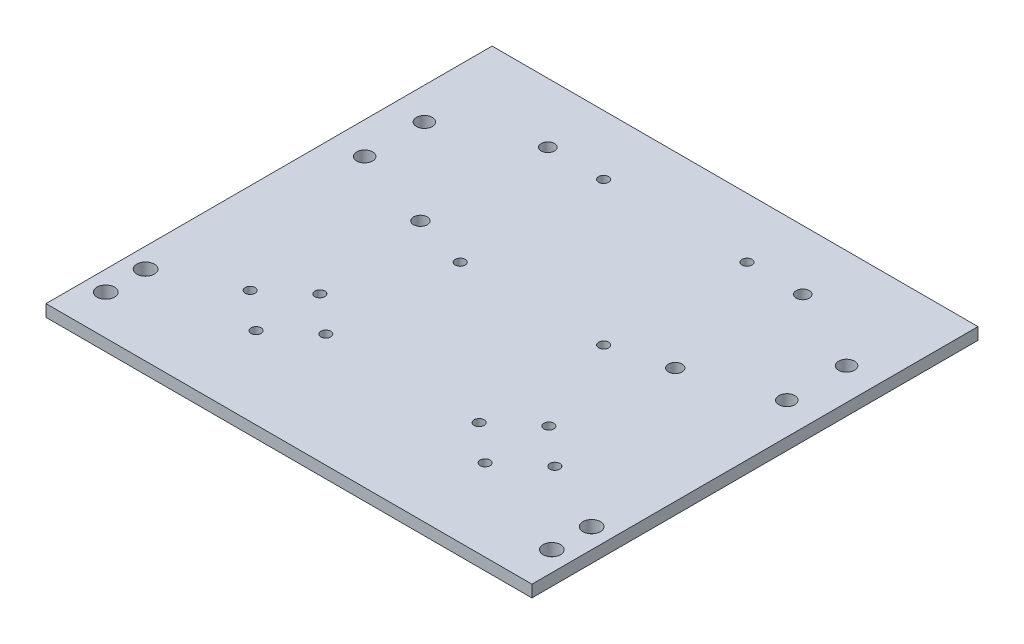
ISO-10303-21;
HEADER;
FILE_DESCRIPTION(('STEP AP214'),'2;1');
FILE_NAME('part.step','',(''),(''),'','','');
FILE_SCHEMA(('AUTOMOTIVE_DESIGN { 1 0 10303 214 1 1 1 1 }'));
ENDSEC;
DATA;
#1=APPLICATION_CONTEXT('core data for automotive mechanical design processes');
#2=APPLICATION_PROTOCOL_DEFINITION('international standard','automotive_design',2000,#1);
#3=PRODUCT_CONTEXT('',#1,'mechanical');
#4=PRODUCT('Part','Part','',(#3));
#5=PRODUCT_RELATED_PRODUCT_CATEGORY('part','',(#4));
#6=PRODUCT_DEFINITION_FORMATION('','',#4);
#7=PRODUCT_DEFINITION_CONTEXT('part definition',#1,'design');
#8=PRODUCT_DEFINITION('design','',#6,#7);
#9=PRODUCT_DEFINITION_SHAPE('','',#8);
#10=(LENGTH_UNIT() NAMED_UNIT(*) SI_UNIT(.MILLI.,.METRE.));
#11=(NAMED_UNIT(*) PLANE_ANGLE_UNIT() SI_UNIT($,.RADIAN.));
#12=(NAMED_UNIT(*) SI_UNIT($,.STERADIAN.) SOLID_ANGLE_UNIT());
#13=UNCERTAINTY_MEASURE_WITH_UNIT(LENGTH_MEASURE(1.E-05),#10,'distance_accuracy_value','');
#14=(GEOMETRIC_REPRESENTATION_CONTEXT(3) GLOBAL_UNCERTAINTY_ASSIGNED_CONTEXT((#13)) GLOBAL_UNIT_ASSIGNED_CONTEXT((#10,
#11,#12)) REPRESENTATION_CONTEXT('',''));
#15=CARTESIAN_POINT('',(0.,0.,0.));
#16=DIRECTION('',(0.,0.,1.));
#17=DIRECTION('',(1.,0.,0.));
#18=AXIS2_PLACEMENT_3D('',#15,#16,#17);
#19=CARTESIAN_POINT('',(61.,3.,-56.));
#20=DIRECTION('',(-1.,0.,0.));
#21=DIRECTION('',(0.,0.,1.));
#22=AXIS2_PLACEMENT_3D('',#19,#20,#21);
#23=PLANE('',#22);
#24=DIRECTION('',(0.,0.,-1.));
#25=VECTOR('',#24,1.);
#26=CARTESIAN_POINT('',(61.,0.,-56.));
#27=LINE('',#26,#25);
#28=CARTESIAN_POINT('',(61.,0.,56.));
#29=VERTEX_POINT('',#28);
#30=CARTESIAN_POINT('',(61.,0.,-56.));
#31=VERTEX_POINT('',#30);
#32=EDGE_CURVE('E111',#29,#31,#27,.T.);
#33=ORIENTED_EDGE('',*,*,#32,.T.);
#34=DIRECTION('',(0.,-1.,0.));
#35=VECTOR('',#34,1.);
#36=CARTESIAN_POINT('',(61.,3.,-56.));
#37=LINE('',#36,#35);
#38=CARTESIAN_POINT('',(61.,3.,-56.));
#39=VERTEX_POINT('',#38);
#40=EDGE_CURVE('E11',#39,#31,#37,.T.);
#41=ORIENTED_EDGE('',*,*,#40,.F.);
#42=DIRECTION('',(0.,0.,-1.));
#43=VECTOR('',#42,1.);
#44=CARTESIAN_POINT('',(61.,3.,-56.));
#45=LINE('',#44,#43);
#46=CARTESIAN_POINT('',(61.,3.,56.));
#47=VERTEX_POINT('',#46);
#48=EDGE_CURVE('E98',#47,#39,#45,.T.);
#49=ORIENTED_EDGE('',*,*,#48,.F.);
#50=DIRECTION('',(0.,-1.,0.));
#51=VECTOR('',#50,1.);
#52=CARTESIAN_POINT('',(61.,3.,56.));
#53=LINE('',#52,#51);
#54=EDGE_CURVE('E107',#47,#29,#53,.T.);
#55=ORIENTED_EDGE('',*,*,#54,.T.);
#56=EDGE_LOOP('',(#33,#41,#49,#55));
#57=FACE_BOUND('',#56,.T.);
#58=ADVANCED_FACE('F45',(#57),#23,.F.);
#59=CARTESIAN_POINT('',(-61.,3.,-56.));
#60=DIRECTION('',(0.,0.,1.));
#61=DIRECTION('',(1.,0.,0.));
#62=AXIS2_PLACEMENT_3D('',#59,#60,#61);
#63=PLANE('',#62);
#64=DIRECTION('',(-1.,0.,0.));
#65=VECTOR('',#64,1.);
#66=CARTESIAN_POINT('',(-61.,0.,-56.));
#67=LINE('',#66,#65);
#68=CARTESIAN_POINT('',(-61.,0.,-56.));
#69=VERTEX_POINT('',#68);
#70=EDGE_CURVE('E102',#31,#69,#67,.T.);
#71=ORIENTED_EDGE('',*,*,#70,.T.);
#72=DIRECTION('',(0.,-1.,0.));
#73=VECTOR('',#72,1.);
#74=CARTESIAN_POINT('',(-61.,3.,-56.));
#75=LINE('',#74,#73);
#76=CARTESIAN_POINT('',(-61.,3.,-56.));
#77=VERTEX_POINT('',#76);
#78=EDGE_CURVE('E54',#77,#69,#75,.T.);
#79=ORIENTED_EDGE('',*,*,#78,.F.);
#80=DIRECTION('',(-1.,0.,0.));
#81=VECTOR('',#80,1.);
#82=CARTESIAN_POINT('',(-61.,3.,-56.));
#83=LINE('',#82,#81);
#84=EDGE_CURVE('E93',#39,#77,#83,.T.);
#85=ORIENTED_EDGE('',*,*,#84,.F.);
#86=ORIENTED_EDGE('',*,*,#40,.T.);
#87=EDGE_LOOP('',(#71,#79,#85,#86));
#88=FACE_BOUND('',#87,.T.);
#89=ADVANCED_FACE('F101',(#88),#63,.F.);
#90=CARTESIAN_POINT('',(-61.,3.,-56.));
#91=DIRECTION('',(1.,0.,0.));
#92=DIRECTION('',(0.,0.,-1.));
#93=AXIS2_PLACEMENT_3D('',#90,#91,#92);
#94=PLANE('',#93);
#95=DIRECTION('',(0.,0.,1.));
#96=VECTOR('',#95,1.);
#97=CARTESIAN_POINT('',(-61.,0.,-56.));
#98=LINE('',#97,#96);
#99=CARTESIAN_POINT('',(-61.,0.,56.));
#100=VERTEX_POINT('',#99);
#101=EDGE_CURVE('E80',#69,#100,#98,.T.);
#102=ORIENTED_EDGE('',*,*,#101,.T.);
#103=DIRECTION('',(0.,-1.,0.));
#104=VECTOR('',#103,1.);
#105=CARTESIAN_POINT('',(-61.,3.,56.));
#106=LINE('',#105,#104);
#107=CARTESIAN_POINT('',(-61.,3.,56.));
#108=VERTEX_POINT('',#107);
#109=EDGE_CURVE('E103',#108,#100,#106,.T.);
#110=ORIENTED_EDGE('',*,*,#109,.F.);
#111=DIRECTION('',(0.,0.,1.));
#112=VECTOR('',#111,1.);
#113=CARTESIAN_POINT('',(-61.,3.,-56.));
#114=LINE('',#113,#112);
#115=EDGE_CURVE('E96',#77,#108,#114,.T.);
#116=ORIENTED_EDGE('',*,*,#115,.F.);
#117=ORIENTED_EDGE('',*,*,#78,.T.);
#118=EDGE_LOOP('',(#102,#110,#116,#117));
#119=FACE_BOUND('',#118,.T.);
#120=ADVANCED_FACE('F105',(#119),#94,.F.);
#121=CARTESIAN_POINT('',(-61.,3.,56.));
#122=DIRECTION('',(0.,0.,-1.));
#123=DIRECTION('',(-1.,0.,0.));
#124=AXIS2_PLACEMENT_3D('',#121,#122,#123);
#125=PLANE('',#124);
#126=DIRECTION('',(1.,0.,0.));
#127=VECTOR('',#126,1.);
#128=CARTESIAN_POINT('',(-61.,0.,56.));
#129=LINE('',#128,#127);
#130=EDGE_CURVE('E86',#100,#29,#129,.T.);
#131=ORIENTED_EDGE('',*,*,#130,.T.);
#132=ORIENTED_EDGE('',*,*,#54,.F.);
#133=DIRECTION('',(1.,0.,0.));
#134=VECTOR('',#133,1.);
#135=CARTESIAN_POINT('',(-61.,3.,56.));
#136=LINE('',#135,#134);
#137=EDGE_CURVE('E63',#108,#47,#136,.T.);
#138=ORIENTED_EDGE('',*,*,#137,.F.);
#139=ORIENTED_EDGE('',*,*,#109,.T.);
#140=EDGE_LOOP('',(#131,#132,#138,#139));
#141=FACE_BOUND('',#140,.T.);
#142=ADVANCED_FACE('F270',(#141),#125,.F.);
#143=CARTESIAN_POINT('',(0.,3.,0.));
#144=DIRECTION('',(0.,1.,0.));
#145=DIRECTION('',(0.,0.,1.));
#146=AXIS2_PLACEMENT_3D('',#143,#144,#145);
#147=PLANE('',#146);
#148=CARTESIAN_POINT('',(56.,3.,46.));
#149=DIRECTION('',(0.,-1.,0.));
#150=DIRECTION('',(0.,0.,1.));
#151=AXIS2_PLACEMENT_3D('',#148,#149,#150);
#152=CIRCLE('',#151,2.2);
#153=CARTESIAN_POINT('',(56.,3.,48.2));
#154=VERTEX_POINT('',#153);
#155=EDGE_CURVE('E195',#154,#154,#152,.T.);
#156=ORIENTED_EDGE('',*,*,#155,.T.);
#157=EDGE_LOOP('',(#156));
#158=FACE_BOUND('',#157,.T.);
#159=CARTESIAN_POINT('',(56.,3.,36.));
#160=DIRECTION('',(0.,-1.,0.));
#161=DIRECTION('',(0.,0.,1.));
#162=AXIS2_PLACEMENT_3D('',#159,#160,#161);
#163=CIRCLE('',#162,2.2);
#164=CARTESIAN_POINT('',(56.,3.,38.2));
#165=VERTEX_POINT('',#164);
#166=EDGE_CURVE('E201',#165,#165,#163,.T.);
#167=ORIENTED_EDGE('',*,*,#166,.T.);
#168=EDGE_LOOP('',(#167));
#169=FACE_BOUND('',#168,.T.);
#170=CARTESIAN_POINT('',(-56.,3.,46.));
#171=DIRECTION('',(0.,1.,0.));
#172=DIRECTION('',(0.,0.,1.));
#173=AXIS2_PLACEMENT_3D('',#170,#171,#172);
#174=CIRCLE('',#173,2.2);
#175=CARTESIAN_POINT('',(-56.,3.,48.2));
#176=VERTEX_POINT('',#175);
#177=EDGE_CURVE('E190',#176,#176,#174,.T.);
#178=ORIENTED_EDGE('',*,*,#177,.F.);
#179=EDGE_LOOP('',(#178));
#180=FACE_BOUND('',#179,.T.);
#181=CARTESIAN_POINT('',(-56.,3.,36.));
#182=DIRECTION('',(0.,1.,0.));
#183=DIRECTION('',(0.,0.,1.));
#184=AXIS2_PLACEMENT_3D('',#181,#182,#183);
#185=CIRCLE('',#184,2.2);
#186=CARTESIAN_POINT('',(-56.,3.,38.2));
#187=VERTEX_POINT('',#186);
#188=EDGE_CURVE('E199',#187,#187,#185,.T.);
#189=ORIENTED_EDGE('',*,*,#188,.F.);
#190=EDGE_LOOP('',(#189));
#191=FACE_BOUND('',#190,.T.);
#192=CARTESIAN_POINT('',(32.,3.,-41.));
#193=DIRECTION('',(0.,1.,0.));
#194=DIRECTION('',(0.,0.,-1.));
#195=AXIS2_PLACEMENT_3D('',#192,#193,#194);
#196=CIRCLE('',#195,1.65);
#197=CARTESIAN_POINT('',(32.,3.,-42.65));
#198=VERTEX_POINT('',#197);
#199=EDGE_CURVE('E192',#198,#198,#196,.T.);
#200=ORIENTED_EDGE('',*,*,#199,.F.);
#201=EDGE_LOOP('',(#200));
#202=FACE_BOUND('',#201,.T.);
#203=CARTESIAN_POINT('',(32.,3.,-9.00000000000002));
#204=DIRECTION('',(0.,1.,0.));
#205=DIRECTION('',(0.,0.,-1.));
#206=AXIS2_PLACEMENT_3D('',#203,#204,#205);
#207=CIRCLE('',#206,1.72273902263788);
#208=CARTESIAN_POINT('',(32.,3.,-10.7227390226379));
#209=VERTEX_POINT('',#208);
#210=EDGE_CURVE('E215',#209,#209,#207,.T.);
#211=ORIENTED_EDGE('',*,*,#210,.F.);
#212=EDGE_LOOP('',(#211));
#213=FACE_BOUND('',#212,.T.);
#214=CARTESIAN_POINT('',(-32.,3.,-9.00000000000002));
#215=DIRECTION('',(0.,1.,0.));
#216=DIRECTION('',(0.,0.,1.));
#217=AXIS2_PLACEMENT_3D('',#214,#215,#216);
#218=CIRCLE('',#217,1.72273902263788);
#219=CARTESIAN_POINT('',(-32.,3.,-7.27726097736215));
#220=VERTEX_POINT('',#219);
#221=EDGE_CURVE('E212',#220,#220,#218,.T.);
#222=ORIENTED_EDGE('',*,*,#221,.F.);
#223=EDGE_LOOP('',(#222));
#224=FACE_BOUND('',#223,.T.);
#225=CARTESIAN_POINT('',(-32.,3.,-41.));
#226=DIRECTION('',(0.,1.,0.));
#227=DIRECTION('',(0.,0.,1.));
#228=AXIS2_PLACEMENT_3D('',#225,#226,#227);
#229=CIRCLE('',#228,1.65);
#230=CARTESIAN_POINT('',(-32.,3.,-39.35));
#231=VERTEX_POINT('',#230);
#232=EDGE_CURVE('E176',#231,#231,#229,.T.);
#233=ORIENTED_EDGE('',*,*,#232,.F.);
#234=EDGE_LOOP('',(#233));
#235=FACE_BOUND('',#234,.T.);
#236=CARTESIAN_POINT('',(-38.25,3.,27.5));
#237=DIRECTION('',(0.,1.,0.));
#238=DIRECTION('',(0.,0.,1.));
#239=AXIS2_PLACEMENT_3D('',#236,#237,#238);
#240=CIRCLE('',#239,1.25);
#241=CARTESIAN_POINT('',(-38.25,3.,28.75));
#242=VERTEX_POINT('',#241);
#243=EDGE_CURVE('E150',#242,#242,#240,.T.);
#244=ORIENTED_EDGE('',*,*,#243,.F.);
#245=EDGE_LOOP('',(#244));
#246=FACE_BOUND('',#245,.T.);
#247=CARTESIAN_POINT('',(28.75,3.,19.5));
#248=DIRECTION('',(0.,1.,0.));
#249=DIRECTION('',(0.,0.,-1.));
#250=AXIS2_PLACEMENT_3D('',#247,#248,#249);
#251=CIRCLE('',#250,1.25);
#252=CARTESIAN_POINT('',(28.75,3.,18.25));
#253=VERTEX_POINT('',#252);
#254=EDGE_CURVE('E185',#253,#253,#251,.T.);
#255=ORIENTED_EDGE('',*,*,#254,.F.);
#256=EDGE_LOOP('',(#255));
#257=FACE_BOUND('',#256,.T.);
#258=CARTESIAN_POINT('',(28.75,3.,35.5));
#259=DIRECTION('',(0.,1.,0.));
#260=DIRECTION('',(0.,0.,1.));
#261=AXIS2_PLACEMENT_3D('',#258,#259,#260);
#262=CIRCLE('',#261,1.25);
#263=CARTESIAN_POINT('',(28.75,3.,36.75));
#264=VERTEX_POINT('',#263);
#265=EDGE_CURVE('E229',#264,#264,#262,.T.);
#266=ORIENTED_EDGE('',*,*,#265,.F.);
#267=EDGE_LOOP('',(#266));
#268=FACE_BOUND('',#267,.T.);
#269=CARTESIAN_POINT('',(19.25,3.,27.5));
#270=DIRECTION('',(0.,1.,0.));
#271=DIRECTION('',(0.,0.,1.));
#272=AXIS2_PLACEMENT_3D('',#269,#270,#271);
#273=CIRCLE('',#272,1.25);
#274=CARTESIAN_POINT('',(19.25,3.,28.75));
#275=VERTEX_POINT('',#274);
#276=EDGE_CURVE('E225',#275,#275,#273,.T.);
#277=ORIENTED_EDGE('',*,*,#276,.F.);
#278=EDGE_LOOP('',(#277));
#279=FACE_BOUND('',#278,.T.);
#280=CARTESIAN_POINT('',(38.25,3.,27.5));
#281=DIRECTION('',(0.,1.,0.));
#282=DIRECTION('',(0.,0.,-1.));
#283=AXIS2_PLACEMENT_3D('',#280,#281,#282);
#284=CIRCLE('',#283,1.25);
#285=CARTESIAN_POINT('',(38.25,3.,26.25));
#286=VERTEX_POINT('',#285);
#287=EDGE_CURVE('E228',#286,#286,#284,.T.);
#288=ORIENTED_EDGE('',*,*,#287,.F.);
#289=EDGE_LOOP('',(#288));
#290=FACE_BOUND('',#289,.T.);
#291=CARTESIAN_POINT('',(-19.25,3.,27.5));
#292=DIRECTION('',(0.,1.,0.));
#293=DIRECTION('',(0.,0.,-1.));
#294=AXIS2_PLACEMENT_3D('',#291,#292,#293);
#295=CIRCLE('',#294,1.25);
#296=CARTESIAN_POINT('',(-19.25,3.,26.25));
#297=VERTEX_POINT('',#296);
#298=EDGE_CURVE('E239',#297,#297,#295,.T.);
#299=ORIENTED_EDGE('',*,*,#298,.F.);
#300=EDGE_LOOP('',(#299));
#301=FACE_BOUND('',#300,.T.);
#302=CARTESIAN_POINT('',(-28.75,3.,19.5));
#303=DIRECTION('',(0.,1.,0.));
#304=DIRECTION('',(0.,0.,1.));
#305=AXIS2_PLACEMENT_3D('',#302,#303,#304);
#306=CIRCLE('',#305,1.25);
#307=CARTESIAN_POINT('',(-28.75,3.,20.75));
#308=VERTEX_POINT('',#307);
#309=EDGE_CURVE('E236',#308,#308,#306,.T.);
#310=ORIENTED_EDGE('',*,*,#309,.F.);
#311=EDGE_LOOP('',(#310));
#312=FACE_BOUND('',#311,.T.);
#313=CARTESIAN_POINT('',(-28.75,3.,35.5));
#314=DIRECTION('',(0.,1.,0.));
#315=DIRECTION('',(0.,0.,-1.));
#316=AXIS2_PLACEMENT_3D('',#313,#314,#315);
#317=CIRCLE('',#316,1.25);
#318=CARTESIAN_POINT('',(-28.75,3.,34.25));
#319=VERTEX_POINT('',#318);
#320=EDGE_CURVE('E224',#319,#319,#317,.T.);
#321=ORIENTED_EDGE('',*,*,#320,.F.);
#322=EDGE_LOOP('',(#321));
#323=FACE_BOUND('',#322,.T.);
#324=CARTESIAN_POINT('',(18.,3.,-41.));
#325=DIRECTION('',(0.,1.,0.));
#326=DIRECTION('',(0.,0.,-1.));
#327=AXIS2_PLACEMENT_3D('',#324,#325,#326);
#328=CIRCLE('',#327,1.25);
#329=CARTESIAN_POINT('',(18.,3.,-42.25));
#330=VERTEX_POINT('',#329);
#331=EDGE_CURVE('E171',#330,#330,#328,.T.);
#332=ORIENTED_EDGE('',*,*,#331,.F.);
#333=EDGE_LOOP('',(#332));
#334=FACE_BOUND('',#333,.T.);
#335=CARTESIAN_POINT('',(18.,3.,-5.00000000000002));
#336=DIRECTION('',(0.,1.,0.));
#337=DIRECTION('',(0.,0.,-1.));
#338=AXIS2_PLACEMENT_3D('',#335,#336,#337);
#339=CIRCLE('',#338,1.25);
#340=CARTESIAN_POINT('',(18.,3.,-6.25000000000003));
#341=VERTEX_POINT('',#340);
#342=EDGE_CURVE('E247',#341,#341,#339,.T.);
#343=ORIENTED_EDGE('',*,*,#342,.F.);
#344=EDGE_LOOP('',(#343));
#345=FACE_BOUND('',#344,.T.);
#346=CARTESIAN_POINT('',(-18.,3.,-5.00000000000002));
#347=DIRECTION('',(0.,1.,0.));
#348=DIRECTION('',(0.,0.,1.));
#349=AXIS2_PLACEMENT_3D('',#346,#347,#348);
#350=CIRCLE('',#349,1.25);
#351=CARTESIAN_POINT('',(-18.,3.,-3.75000000000002));
#352=VERTEX_POINT('',#351);
#353=EDGE_CURVE('E244',#352,#352,#350,.T.);
#354=ORIENTED_EDGE('',*,*,#353,.F.);
#355=EDGE_LOOP('',(#354));
#356=FACE_BOUND('',#355,.T.);
#357=CARTESIAN_POINT('',(-18.,3.,-41.));
#358=DIRECTION('',(0.,1.,0.));
#359=DIRECTION('',(0.,0.,1.));
#360=AXIS2_PLACEMENT_3D('',#357,#358,#359);
#361=CIRCLE('',#360,1.25);
#362=CARTESIAN_POINT('',(-18.,3.,-39.75));
#363=VERTEX_POINT('',#362);
#364=EDGE_CURVE('E136',#363,#363,#361,.T.);
#365=ORIENTED_EDGE('',*,*,#364,.F.);
#366=EDGE_LOOP('',(#365));
#367=FACE_BOUND('',#366,.T.);
#368=CARTESIAN_POINT('',(53.,3.,-31.));
#369=DIRECTION('',(0.,1.,0.));
#370=DIRECTION('',(0.,0.,-1.));
#371=AXIS2_PLACEMENT_3D('',#368,#369,#370);
#372=CIRCLE('',#371,2.);
#373=CARTESIAN_POINT('',(53.,3.,-33.));
#374=VERTEX_POINT('',#373);
#375=EDGE_CURVE('E145',#374,#374,#372,.T.);
#376=ORIENTED_EDGE('',*,*,#375,.F.);
#377=EDGE_LOOP('',(#376));
#378=FACE_BOUND('',#377,.T.);
#379=CARTESIAN_POINT('',(53.,3.,-16.));
#380=DIRECTION('',(0.,1.,0.));
#381=DIRECTION('',(0.,0.,-1.));
#382=AXIS2_PLACEMENT_3D('',#379,#380,#381);
#383=CIRCLE('',#382,2.);
#384=CARTESIAN_POINT('',(53.,3.,-18.));
#385=VERTEX_POINT('',#384);
#386=EDGE_CURVE('E257',#385,#385,#383,.T.);
#387=ORIENTED_EDGE('',*,*,#386,.F.);
#388=EDGE_LOOP('',(#387));
#389=FACE_BOUND('',#388,.T.);
#390=CARTESIAN_POINT('',(-53.,3.,-16.));
#391=DIRECTION('',(0.,1.,0.));
#392=DIRECTION('',(0.,0.,1.));
#393=AXIS2_PLACEMENT_3D('',#390,#391,#392);
#394=CIRCLE('',#393,2.);
#395=CARTESIAN_POINT('',(-53.,3.,-14.));
#396=VERTEX_POINT('',#395);
#397=EDGE_CURVE('E254',#396,#396,#394,.T.);
#398=ORIENTED_EDGE('',*,*,#397,.F.);
#399=EDGE_LOOP('',(#398));
#400=FACE_BOUND('',#399,.T.);
#401=CARTESIAN_POINT('',(-53.,3.,-31.));
#402=DIRECTION('',(0.,1.,0.));
#403=DIRECTION('',(0.,0.,1.));
#404=AXIS2_PLACEMENT_3D('',#401,#402,#403);
#405=CIRCLE('',#404,2.);
#406=CARTESIAN_POINT('',(-53.,3.,-29.));
#407=VERTEX_POINT('',#406);
#408=EDGE_CURVE('E124',#407,#407,#405,.T.);
#409=ORIENTED_EDGE('',*,*,#408,.F.);
#410=EDGE_LOOP('',(#409));
#411=FACE_BOUND('',#410,.T.);
#412=ORIENTED_EDGE('',*,*,#48,.T.);
#413=ORIENTED_EDGE('',*,*,#84,.T.);
#414=ORIENTED_EDGE('',*,*,#115,.T.);
#415=ORIENTED_EDGE('',*,*,#137,.T.);
#416=EDGE_LOOP('',(#412,#413,#414,#415));
#417=FACE_BOUND('',#416,.T.);
#418=ADVANCED_FACE('F94',(#158,#169,#180,#191,#202,#213,#224,#235,#246,#257,#268,#279,#290,#301,
#312,#323,#334,#345,#356,#367,#378,#389,#400,#411,#417),#147,.T.);
#419=CARTESIAN_POINT('',(0.,0.,0.));
#420=DIRECTION('',(0.,1.,0.));
#421=DIRECTION('',(0.,0.,1.));
#422=AXIS2_PLACEMENT_3D('',#419,#420,#421);
#423=PLANE('',#422);
#424=CARTESIAN_POINT('',(56.,0.,46.));
#425=DIRECTION('',(0.,1.,0.));
#426=DIRECTION('',(0.,0.,1.));
#427=AXIS2_PLACEMENT_3D('',#424,#425,#426);
#428=CIRCLE('',#427,2.2);
#429=CARTESIAN_POINT('',(56.,0.,48.2));
#430=VERTEX_POINT('',#429);
#431=EDGE_CURVE('E48',#430,#430,#428,.F.);
#432=ORIENTED_EDGE('',*,*,#431,.F.);
#433=EDGE_LOOP('',(#432));
#434=FACE_BOUND('',#433,.T.);
#435=CARTESIAN_POINT('',(56.,0.,36.));
#436=DIRECTION('',(0.,1.,0.));
#437=DIRECTION('',(0.,0.,1.));
#438=AXIS2_PLACEMENT_3D('',#435,#436,#437);
#439=CIRCLE('',#438,2.2);
#440=CARTESIAN_POINT('',(56.,0.,38.2));
#441=VERTEX_POINT('',#440);
#442=EDGE_CURVE('E193',#441,#441,#439,.F.);
#443=ORIENTED_EDGE('',*,*,#442,.F.);
#444=EDGE_LOOP('',(#443));
#445=FACE_BOUND('',#444,.T.);
#446=CARTESIAN_POINT('',(-56.,0.,46.));
#447=DIRECTION('',(0.,1.,0.));
#448=DIRECTION('',(0.,0.,1.));
#449=AXIS2_PLACEMENT_3D('',#446,#447,#448);
#450=CIRCLE('',#449,2.2);
#451=CARTESIAN_POINT('',(-56.,0.,48.2));
#452=VERTEX_POINT('',#451);
#453=EDGE_CURVE('E189',#452,#452,#450,.T.);
#454=ORIENTED_EDGE('',*,*,#453,.T.);
#455=EDGE_LOOP('',(#454));
#456=FACE_BOUND('',#455,.T.);
#457=CARTESIAN_POINT('',(-56.,0.,36.));
#458=DIRECTION('',(0.,1.,0.));
#459=DIRECTION('',(0.,0.,1.));
#460=AXIS2_PLACEMENT_3D('',#457,#458,#459);
#461=CIRCLE('',#460,2.2);
#462=CARTESIAN_POINT('',(-56.,0.,38.2));
#463=VERTEX_POINT('',#462);
#464=EDGE_CURVE('E186',#463,#463,#461,.T.);
#465=ORIENTED_EDGE('',*,*,#464,.T.);
#466=EDGE_LOOP('',(#465));
#467=FACE_BOUND('',#466,.T.);
#468=CARTESIAN_POINT('',(32.,0.,-41.));
#469=DIRECTION('',(0.,1.,0.));
#470=DIRECTION('',(0.,0.,1.));
#471=AXIS2_PLACEMENT_3D('',#468,#469,#470);
#472=CIRCLE('',#471,1.65);
#473=CARTESIAN_POINT('',(32.,0.,-39.35));
#474=VERTEX_POINT('',#473);
#475=EDGE_CURVE('E182',#474,#474,#472,.T.);
#476=ORIENTED_EDGE('',*,*,#475,.T.);
#477=EDGE_LOOP('',(#476));
#478=FACE_BOUND('',#477,.T.);
#479=CARTESIAN_POINT('',(32.,0.,-9.00000000000002));
#480=DIRECTION('',(0.,1.,0.));
#481=DIRECTION('',(0.,0.,1.));
#482=AXIS2_PLACEMENT_3D('',#479,#480,#481);
#483=CIRCLE('',#482,1.72273902263788);
#484=CARTESIAN_POINT('',(32.,0.,-7.27726097736215));
#485=VERTEX_POINT('',#484);
#486=EDGE_CURVE('E179',#485,#485,#483,.T.);
#487=ORIENTED_EDGE('',*,*,#486,.T.);
#488=EDGE_LOOP('',(#487));
#489=FACE_BOUND('',#488,.T.);
#490=CARTESIAN_POINT('',(-32.,0.,-9.00000000000002));
#491=DIRECTION('',(0.,1.,0.));
#492=DIRECTION('',(0.,0.,1.));
#493=AXIS2_PLACEMENT_3D('',#490,#491,#492);
#494=CIRCLE('',#493,1.72273902263788);
#495=CARTESIAN_POINT('',(-32.,0.,-7.27726097736215));
#496=VERTEX_POINT('',#495);
#497=EDGE_CURVE('E175',#496,#496,#494,.T.);
#498=ORIENTED_EDGE('',*,*,#497,.T.);
#499=EDGE_LOOP('',(#498));
#500=FACE_BOUND('',#499,.T.);
#501=CARTESIAN_POINT('',(-32.,0.,-41.));
#502=DIRECTION('',(0.,1.,0.));
#503=DIRECTION('',(0.,0.,1.));
#504=AXIS2_PLACEMENT_3D('',#501,#502,#503);
#505=CIRCLE('',#504,1.65);
#506=CARTESIAN_POINT('',(-32.,0.,-39.35));
#507=VERTEX_POINT('',#506);
#508=EDGE_CURVE('E172',#507,#507,#505,.T.);
#509=ORIENTED_EDGE('',*,*,#508,.T.);
#510=EDGE_LOOP('',(#509));
#511=FACE_BOUND('',#510,.T.);
#512=CARTESIAN_POINT('',(-38.25,0.,27.5));
#513=DIRECTION('',(0.,1.,0.));
#514=DIRECTION('',(0.,0.,1.));
#515=AXIS2_PLACEMENT_3D('',#512,#513,#514);
#516=CIRCLE('',#515,1.25);
#517=CARTESIAN_POINT('',(-38.25,0.,28.75));
#518=VERTEX_POINT('',#517);
#519=EDGE_CURVE('E168',#518,#518,#516,.T.);
#520=ORIENTED_EDGE('',*,*,#519,.T.);
#521=EDGE_LOOP('',(#520));
#522=FACE_BOUND('',#521,.T.);
#523=CARTESIAN_POINT('',(28.75,0.,19.5));
#524=DIRECTION('',(0.,1.,0.));
#525=DIRECTION('',(0.,0.,1.));
#526=AXIS2_PLACEMENT_3D('',#523,#524,#525);
#527=CIRCLE('',#526,1.25);
#528=CARTESIAN_POINT('',(28.75,0.,20.75));
#529=VERTEX_POINT('',#528);
#530=EDGE_CURVE('E165',#529,#529,#527,.T.);
#531=ORIENTED_EDGE('',*,*,#530,.T.);
#532=EDGE_LOOP('',(#531));
#533=FACE_BOUND('',#532,.T.);
#534=CARTESIAN_POINT('',(28.75,0.,35.5));
#535=DIRECTION('',(0.,1.,0.));
#536=DIRECTION('',(0.,0.,1.));
#537=AXIS2_PLACEMENT_3D('',#534,#535,#536);
#538=CIRCLE('',#537,1.25);
#539=CARTESIAN_POINT('',(28.75,0.,36.75));
#540=VERTEX_POINT('',#539);
#541=EDGE_CURVE('E162',#540,#540,#538,.T.);
#542=ORIENTED_EDGE('',*,*,#541,.T.);
#543=EDGE_LOOP('',(#542));
#544=FACE_BOUND('',#543,.T.);
#545=CARTESIAN_POINT('',(19.25,0.,27.5));
#546=DIRECTION('',(0.,1.,0.));
#547=DIRECTION('',(0.,0.,1.));
#548=AXIS2_PLACEMENT_3D('',#545,#546,#547);
#549=CIRCLE('',#548,1.25);
#550=CARTESIAN_POINT('',(19.25,0.,28.75));
#551=VERTEX_POINT('',#550);
#552=EDGE_CURVE('E159',#551,#551,#549,.T.);
#553=ORIENTED_EDGE('',*,*,#552,.T.);
#554=EDGE_LOOP('',(#553));
#555=FACE_BOUND('',#554,.T.);
#556=CARTESIAN_POINT('',(38.25,0.,27.5));
#557=DIRECTION('',(0.,1.,0.));
#558=DIRECTION('',(0.,0.,1.));
#559=AXIS2_PLACEMENT_3D('',#556,#557,#558);
#560=CIRCLE('',#559,1.25);
#561=CARTESIAN_POINT('',(38.25,0.,28.75));
#562=VERTEX_POINT('',#561);
#563=EDGE_CURVE('E156',#562,#562,#560,.T.);
#564=ORIENTED_EDGE('',*,*,#563,.T.);
#565=EDGE_LOOP('',(#564));
#566=FACE_BOUND('',#565,.T.);
#567=CARTESIAN_POINT('',(-19.25,0.,27.5));
#568=DIRECTION('',(0.,1.,0.));
#569=DIRECTION('',(0.,0.,1.));
#570=AXIS2_PLACEMENT_3D('',#567,#568,#569);
#571=CIRCLE('',#570,1.25);
#572=CARTESIAN_POINT('',(-19.25,0.,28.75));
#573=VERTEX_POINT('',#572);
#574=EDGE_CURVE('E153',#573,#573,#571,.T.);
#575=ORIENTED_EDGE('',*,*,#574,.T.);
#576=EDGE_LOOP('',(#575));
#577=FACE_BOUND('',#576,.T.);
#578=CARTESIAN_POINT('',(-28.75,0.,19.5));
#579=DIRECTION('',(0.,1.,0.));
#580=DIRECTION('',(0.,0.,1.));
#581=AXIS2_PLACEMENT_3D('',#578,#579,#580);
#582=CIRCLE('',#581,1.25);
#583=CARTESIAN_POINT('',(-28.75,0.,20.75));
#584=VERTEX_POINT('',#583);
#585=EDGE_CURVE('E149',#584,#584,#582,.T.);
#586=ORIENTED_EDGE('',*,*,#585,.T.);
#587=EDGE_LOOP('',(#586));
#588=FACE_BOUND('',#587,.T.);
#589=CARTESIAN_POINT('',(-28.75,0.,35.5));
#590=DIRECTION('',(0.,1.,0.));
#591=DIRECTION('',(0.,0.,1.));
#592=AXIS2_PLACEMENT_3D('',#589,#590,#591);
#593=CIRCLE('',#592,1.25);
#594=CARTESIAN_POINT('',(-28.75,0.,36.75));
#595=VERTEX_POINT('',#594);
#596=EDGE_CURVE('E146',#595,#595,#593,.T.);
#597=ORIENTED_EDGE('',*,*,#596,.T.);
#598=EDGE_LOOP('',(#597));
#599=FACE_BOUND('',#598,.T.);
#600=CARTESIAN_POINT('',(18.,0.,-41.));
#601=DIRECTION('',(0.,1.,0.));
#602=DIRECTION('',(0.,0.,1.));
#603=AXIS2_PLACEMENT_3D('',#600,#601,#602);
#604=CIRCLE('',#603,1.25);
#605=CARTESIAN_POINT('',(18.,0.,-39.75));
#606=VERTEX_POINT('',#605);
#607=EDGE_CURVE('E142',#606,#606,#604,.T.);
#608=ORIENTED_EDGE('',*,*,#607,.T.);
#609=EDGE_LOOP('',(#608));
#610=FACE_BOUND('',#609,.T.);
#611=CARTESIAN_POINT('',(18.,0.,-5.00000000000002));
#612=DIRECTION('',(0.,1.,0.));
#613=DIRECTION('',(0.,0.,1.));
#614=AXIS2_PLACEMENT_3D('',#611,#612,#613);
#615=CIRCLE('',#614,1.25);
#616=CARTESIAN_POINT('',(18.,0.,-3.75000000000002));
#617=VERTEX_POINT('',#616);
#618=EDGE_CURVE('E139',#617,#617,#615,.T.);
#619=ORIENTED_EDGE('',*,*,#618,.T.);
#620=EDGE_LOOP('',(#619));
#621=FACE_BOUND('',#620,.T.);
#622=CARTESIAN_POINT('',(-18.,0.,-5.00000000000002));
#623=DIRECTION('',(0.,1.,0.));
#624=DIRECTION('',(0.,0.,1.));
#625=AXIS2_PLACEMENT_3D('',#622,#623,#624);
#626=CIRCLE('',#625,1.25);
#627=CARTESIAN_POINT('',(-18.,0.,-3.75000000000002));
#628=VERTEX_POINT('',#627);
#629=EDGE_CURVE('E135',#628,#628,#626,.T.);
#630=ORIENTED_EDGE('',*,*,#629,.T.);
#631=EDGE_LOOP('',(#630));
#632=FACE_BOUND('',#631,.T.);
#633=CARTESIAN_POINT('',(-18.,0.,-41.));
#634=DIRECTION('',(0.,1.,0.));
#635=DIRECTION('',(0.,0.,1.));
#636=AXIS2_PLACEMENT_3D('',#633,#634,#635);
#637=CIRCLE('',#636,1.25);
#638=CARTESIAN_POINT('',(-18.,0.,-39.75));
#639=VERTEX_POINT('',#638);
#640=EDGE_CURVE('E132',#639,#639,#637,.T.);
#641=ORIENTED_EDGE('',*,*,#640,.T.);
#642=EDGE_LOOP('',(#641));
#643=FACE_BOUND('',#642,.T.);
#644=CARTESIAN_POINT('',(53.,0.,-31.));
#645=DIRECTION('',(0.,1.,0.));
#646=DIRECTION('',(0.,0.,1.));
#647=AXIS2_PLACEMENT_3D('',#644,#645,#646);
#648=CIRCLE('',#647,2.);
#649=CARTESIAN_POINT('',(53.,0.,-29.));
#650=VERTEX_POINT('',#649);
#651=EDGE_CURVE('E114',#650,#650,#648,.T.);
#652=ORIENTED_EDGE('',*,*,#651,.T.);
#653=EDGE_LOOP('',(#652));
#654=FACE_BOUND('',#653,.T.);
#655=CARTESIAN_POINT('',(53.,0.,-16.));
#656=DIRECTION('',(0.,1.,0.));
#657=DIRECTION('',(0.,0.,1.));
#658=AXIS2_PLACEMENT_3D('',#655,#656,#657);
#659=CIRCLE('',#658,2.);
#660=CARTESIAN_POINT('',(53.,0.,-14.));
#661=VERTEX_POINT('',#660);
#662=EDGE_CURVE('E127',#661,#661,#659,.T.);
#663=ORIENTED_EDGE('',*,*,#662,.T.);
#664=EDGE_LOOP('',(#663));
#665=FACE_BOUND('',#664,.T.);
#666=CARTESIAN_POINT('',(-53.,0.,-16.));
#667=DIRECTION('',(0.,1.,0.));
#668=DIRECTION('',(0.,0.,1.));
#669=AXIS2_PLACEMENT_3D('',#666,#667,#668);
#670=CIRCLE('',#669,2.);
#671=CARTESIAN_POINT('',(-53.,0.,-14.));
#672=VERTEX_POINT('',#671);
#673=EDGE_CURVE('E123',#672,#672,#670,.T.);
#674=ORIENTED_EDGE('',*,*,#673,.T.);
#675=EDGE_LOOP('',(#674));
#676=FACE_BOUND('',#675,.T.);
#677=CARTESIAN_POINT('',(-53.,0.,-31.));
#678=DIRECTION('',(0.,1.,0.));
#679=DIRECTION('',(0.,0.,1.));
#680=AXIS2_PLACEMENT_3D('',#677,#678,#679);
#681=CIRCLE('',#680,2.);
#682=CARTESIAN_POINT('',(-53.,0.,-29.));
#683=VERTEX_POINT('',#682);
#684=EDGE_CURVE('E120',#683,#683,#681,.T.);
#685=ORIENTED_EDGE('',*,*,#684,.T.);
#686=EDGE_LOOP('',(#685));
#687=FACE_BOUND('',#686,.T.);
#688=ORIENTED_EDGE('',*,*,#32,.F.);
#689=ORIENTED_EDGE('',*,*,#130,.F.);
#690=ORIENTED_EDGE('',*,*,#101,.F.);
#691=ORIENTED_EDGE('',*,*,#70,.F.);
#692=EDGE_LOOP('',(#688,#689,#690,#691));
#693=FACE_BOUND('',#692,.T.);
#694=ADVANCED_FACE('F269',(#434,#445,#456,#467,#478,#489,#500,#511,#522,#533,#544,#555,#566,
#577,#588,#599,#610,#621,#632,#643,#654,#665,#676,#687,#693),#423,.F.);
#695=CARTESIAN_POINT('',(-53.,-7.,-31.));
#696=DIRECTION('',(0.,1.,0.));
#697=DIRECTION('',(0.,0.,1.));
#698=AXIS2_PLACEMENT_3D('',#695,#696,#697);
#699=CYLINDRICAL_SURFACE('',#698,2.);
#700=ORIENTED_EDGE('',*,*,#408,.T.);
#701=EDGE_LOOP('',(#700));
#702=FACE_BOUND('',#701,.T.);
#703=ORIENTED_EDGE('',*,*,#684,.F.);
#704=EDGE_LOOP('',(#703));
#705=FACE_BOUND('',#704,.T.);
#706=ADVANCED_FACE('F265',(#702,#705),#699,.F.);
#707=CARTESIAN_POINT('',(-53.,-7.,-16.));
#708=DIRECTION('',(0.,1.,0.));
#709=DIRECTION('',(0.,0.,1.));
#710=AXIS2_PLACEMENT_3D('',#707,#708,#709);
#711=CYLINDRICAL_SURFACE('',#710,2.);
#712=ORIENTED_EDGE('',*,*,#397,.T.);
#713=EDGE_LOOP('',(#712));
#714=FACE_BOUND('',#713,.T.);
#715=ORIENTED_EDGE('',*,*,#673,.F.);
#716=EDGE_LOOP('',(#715));
#717=FACE_BOUND('',#716,.T.);
#718=ADVANCED_FACE('F305',(#714,#717),#711,.F.);
#719=CARTESIAN_POINT('',(53.,-7.,-16.));
#720=DIRECTION('',(0.,1.,0.));
#721=DIRECTION('',(0.,0.,1.));
#722=AXIS2_PLACEMENT_3D('',#719,#720,#721);
#723=CYLINDRICAL_SURFACE('',#722,2.);
#724=ORIENTED_EDGE('',*,*,#386,.T.);
#725=EDGE_LOOP('',(#724));
#726=FACE_BOUND('',#725,.T.);
#727=ORIENTED_EDGE('',*,*,#662,.F.);
#728=EDGE_LOOP('',(#727));
#729=FACE_BOUND('',#728,.T.);
#730=ADVANCED_FACE('F312',(#726,#729),#723,.F.);
#731=CARTESIAN_POINT('',(53.,-7.,-31.));
#732=DIRECTION('',(0.,1.,0.));
#733=DIRECTION('',(0.,0.,1.));
#734=AXIS2_PLACEMENT_3D('',#731,#732,#733);
#735=CYLINDRICAL_SURFACE('',#734,2.);
#736=ORIENTED_EDGE('',*,*,#375,.T.);
#737=EDGE_LOOP('',(#736));
#738=FACE_BOUND('',#737,.T.);
#739=ORIENTED_EDGE('',*,*,#651,.F.);
#740=EDGE_LOOP('',(#739));
#741=FACE_BOUND('',#740,.T.);
#742=ADVANCED_FACE('F320',(#738,#741),#735,.F.);
#743=CARTESIAN_POINT('',(-18.,-20.,-41.));
#744=DIRECTION('',(0.,1.,0.));
#745=DIRECTION('',(0.,0.,1.));
#746=AXIS2_PLACEMENT_3D('',#743,#744,#745);
#747=CYLINDRICAL_SURFACE('',#746,1.25);
#748=ORIENTED_EDGE('',*,*,#364,.T.);
#749=EDGE_LOOP('',(#748));
#750=FACE_BOUND('',#749,.T.);
#751=ORIENTED_EDGE('',*,*,#640,.F.);
#752=EDGE_LOOP('',(#751));
#753=FACE_BOUND('',#752,.T.);
#754=ADVANCED_FACE('F328',(#750,#753),#747,.F.);
#755=CARTESIAN_POINT('',(-18.,-20.,-5.00000000000002));
#756=DIRECTION('',(0.,1.,0.));
#757=DIRECTION('',(0.,0.,1.));
#758=AXIS2_PLACEMENT_3D('',#755,#756,#757);
#759=CYLINDRICAL_SURFACE('',#758,1.25);
#760=ORIENTED_EDGE('',*,*,#353,.T.);
#761=EDGE_LOOP('',(#760));
#762=FACE_BOUND('',#761,.T.);
#763=ORIENTED_EDGE('',*,*,#629,.F.);
#764=EDGE_LOOP('',(#763));
#765=FACE_BOUND('',#764,.T.);
#766=ADVANCED_FACE('F336',(#762,#765),#759,.F.);
#767=CARTESIAN_POINT('',(18.,-20.,-5.00000000000002));
#768=DIRECTION('',(0.,1.,0.));
#769=DIRECTION('',(0.,0.,1.));
#770=AXIS2_PLACEMENT_3D('',#767,#768,#769);
#771=CYLINDRICAL_SURFACE('',#770,1.25);
#772=ORIENTED_EDGE('',*,*,#342,.T.);
#773=EDGE_LOOP('',(#772));
#774=FACE_BOUND('',#773,.T.);
#775=ORIENTED_EDGE('',*,*,#618,.F.);
#776=EDGE_LOOP('',(#775));
#777=FACE_BOUND('',#776,.T.);
#778=ADVANCED_FACE('F344',(#774,#777),#771,.F.);
#779=CARTESIAN_POINT('',(18.,-20.,-41.));
#780=DIRECTION('',(0.,1.,0.));
#781=DIRECTION('',(0.,0.,1.));
#782=AXIS2_PLACEMENT_3D('',#779,#780,#781);
#783=CYLINDRICAL_SURFACE('',#782,1.25);
#784=ORIENTED_EDGE('',*,*,#331,.T.);
#785=EDGE_LOOP('',(#784));
#786=FACE_BOUND('',#785,.T.);
#787=ORIENTED_EDGE('',*,*,#607,.F.);
#788=EDGE_LOOP('',(#787));
#789=FACE_BOUND('',#788,.T.);
#790=ADVANCED_FACE('F352',(#786,#789),#783,.F.);
#791=CARTESIAN_POINT('',(-28.75,-20.,35.5));
#792=DIRECTION('',(0.,1.,0.));
#793=DIRECTION('',(0.,0.,1.));
#794=AXIS2_PLACEMENT_3D('',#791,#792,#793);
#795=CYLINDRICAL_SURFACE('',#794,1.25);
#796=ORIENTED_EDGE('',*,*,#320,.T.);
#797=EDGE_LOOP('',(#796));
#798=FACE_BOUND('',#797,.T.);
#799=ORIENTED_EDGE('',*,*,#596,.F.);
#800=EDGE_LOOP('',(#799));
#801=FACE_BOUND('',#800,.T.);
#802=ADVANCED_FACE('F360',(#798,#801),#795,.F.);
#803=CARTESIAN_POINT('',(-28.75,-20.,19.5));
#804=DIRECTION('',(0.,1.,0.));
#805=DIRECTION('',(0.,0.,1.));
#806=AXIS2_PLACEMENT_3D('',#803,#804,#805);
#807=CYLINDRICAL_SURFACE('',#806,1.25);
#808=ORIENTED_EDGE('',*,*,#309,.T.);
#809=EDGE_LOOP('',(#808));
#810=FACE_BOUND('',#809,.T.);
#811=ORIENTED_EDGE('',*,*,#585,.F.);
#812=EDGE_LOOP('',(#811));
#813=FACE_BOUND('',#812,.T.);
#814=ADVANCED_FACE('F368',(#810,#813),#807,.F.);
#815=CARTESIAN_POINT('',(-19.25,-20.,27.5));
#816=DIRECTION('',(0.,1.,0.));
#817=DIRECTION('',(0.,0.,1.));
#818=AXIS2_PLACEMENT_3D('',#815,#816,#817);
#819=CYLINDRICAL_SURFACE('',#818,1.25);
#820=ORIENTED_EDGE('',*,*,#298,.T.);
#821=EDGE_LOOP('',(#820));
#822=FACE_BOUND('',#821,.T.);
#823=ORIENTED_EDGE('',*,*,#574,.F.);
#824=EDGE_LOOP('',(#823));
#825=FACE_BOUND('',#824,.T.);
#826=ADVANCED_FACE('F376',(#822,#825),#819,.F.);
#827=CARTESIAN_POINT('',(38.25,-20.,27.5));
#828=DIRECTION('',(0.,1.,0.));
#829=DIRECTION('',(0.,0.,1.));
#830=AXIS2_PLACEMENT_3D('',#827,#828,#829);
#831=CYLINDRICAL_SURFACE('',#830,1.25);
#832=ORIENTED_EDGE('',*,*,#287,.T.);
#833=EDGE_LOOP('',(#832));
#834=FACE_BOUND('',#833,.T.);
#835=ORIENTED_EDGE('',*,*,#563,.F.);
#836=EDGE_LOOP('',(#835));
#837=FACE_BOUND('',#836,.T.);
#838=ADVANCED_FACE('F384',(#834,#837),#831,.F.);
#839=CARTESIAN_POINT('',(19.25,-20.,27.5));
#840=DIRECTION('',(0.,1.,0.));
#841=DIRECTION('',(0.,0.,1.));
#842=AXIS2_PLACEMENT_3D('',#839,#840,#841);
#843=CYLINDRICAL_SURFACE('',#842,1.25);
#844=ORIENTED_EDGE('',*,*,#276,.T.);
#845=EDGE_LOOP('',(#844));
#846=FACE_BOUND('',#845,.T.);
#847=ORIENTED_EDGE('',*,*,#552,.F.);
#848=EDGE_LOOP('',(#847));
#849=FACE_BOUND('',#848,.T.);
#850=ADVANCED_FACE('F392',(#846,#849),#843,.F.);
#851=CARTESIAN_POINT('',(28.75,-20.,35.5));
#852=DIRECTION('',(0.,1.,0.));
#853=DIRECTION('',(0.,0.,1.));
#854=AXIS2_PLACEMENT_3D('',#851,#852,#853);
#855=CYLINDRICAL_SURFACE('',#854,1.25);
#856=ORIENTED_EDGE('',*,*,#265,.T.);
#857=EDGE_LOOP('',(#856));
#858=FACE_BOUND('',#857,.T.);
#859=ORIENTED_EDGE('',*,*,#541,.F.);
#860=EDGE_LOOP('',(#859));
#861=FACE_BOUND('',#860,.T.);
#862=ADVANCED_FACE('F400',(#858,#861),#855,.F.);
#863=CARTESIAN_POINT('',(28.75,-20.,19.5));
#864=DIRECTION('',(0.,1.,0.));
#865=DIRECTION('',(0.,0.,1.));
#866=AXIS2_PLACEMENT_3D('',#863,#864,#865);
#867=CYLINDRICAL_SURFACE('',#866,1.25);
#868=ORIENTED_EDGE('',*,*,#254,.T.);
#869=EDGE_LOOP('',(#868));
#870=FACE_BOUND('',#869,.T.);
#871=ORIENTED_EDGE('',*,*,#530,.F.);
#872=EDGE_LOOP('',(#871));
#873=FACE_BOUND('',#872,.T.);
#874=ADVANCED_FACE('F408',(#870,#873),#867,.F.);
#875=CARTESIAN_POINT('',(-38.25,-20.,27.5));
#876=DIRECTION('',(0.,1.,0.));
#877=DIRECTION('',(0.,0.,1.));
#878=AXIS2_PLACEMENT_3D('',#875,#876,#877);
#879=CYLINDRICAL_SURFACE('',#878,1.25);
#880=ORIENTED_EDGE('',*,*,#243,.T.);
#881=EDGE_LOOP('',(#880));
#882=FACE_BOUND('',#881,.T.);
#883=ORIENTED_EDGE('',*,*,#519,.F.);
#884=EDGE_LOOP('',(#883));
#885=FACE_BOUND('',#884,.T.);
#886=ADVANCED_FACE('F416',(#882,#885),#879,.F.);
#887=CARTESIAN_POINT('',(-32.,-7.,-41.));
#888=DIRECTION('',(0.,1.,0.));
#889=DIRECTION('',(0.,0.,1.));
#890=AXIS2_PLACEMENT_3D('',#887,#888,#889);
#891=CYLINDRICAL_SURFACE('',#890,1.65);
#892=ORIENTED_EDGE('',*,*,#232,.T.);
#893=EDGE_LOOP('',(#892));
#894=FACE_BOUND('',#893,.T.);
#895=ORIENTED_EDGE('',*,*,#508,.F.);
#896=EDGE_LOOP('',(#895));
#897=FACE_BOUND('',#896,.T.);
#898=ADVANCED_FACE('F424',(#894,#897),#891,.F.);
#899=CARTESIAN_POINT('',(-32.,-7.,-9.00000000000002));
#900=DIRECTION('',(0.,1.,0.));
#901=DIRECTION('',(0.,0.,1.));
#902=AXIS2_PLACEMENT_3D('',#899,#900,#901);
#903=CYLINDRICAL_SURFACE('',#902,1.72273902263788);
#904=ORIENTED_EDGE('',*,*,#221,.T.);
#905=EDGE_LOOP('',(#904));
#906=FACE_BOUND('',#905,.T.);
#907=ORIENTED_EDGE('',*,*,#497,.F.);
#908=EDGE_LOOP('',(#907));
#909=FACE_BOUND('',#908,.T.);
#910=ADVANCED_FACE('F432',(#906,#909),#903,.F.);
#911=CARTESIAN_POINT('',(32.,-7.,-9.00000000000002));
#912=DIRECTION('',(0.,1.,0.));
#913=DIRECTION('',(0.,0.,1.));
#914=AXIS2_PLACEMENT_3D('',#911,#912,#913);
#915=CYLINDRICAL_SURFACE('',#914,1.72273902263788);
#916=ORIENTED_EDGE('',*,*,#210,.T.);
#917=EDGE_LOOP('',(#916));
#918=FACE_BOUND('',#917,.T.);
#919=ORIENTED_EDGE('',*,*,#486,.F.);
#920=EDGE_LOOP('',(#919));
#921=FACE_BOUND('',#920,.T.);
#922=ADVANCED_FACE('F440',(#918,#921),#915,.F.);
#923=CARTESIAN_POINT('',(32.,-7.,-41.));
#924=DIRECTION('',(0.,1.,0.));
#925=DIRECTION('',(0.,0.,1.));
#926=AXIS2_PLACEMENT_3D('',#923,#924,#925);
#927=CYLINDRICAL_SURFACE('',#926,1.65);
#928=ORIENTED_EDGE('',*,*,#199,.T.);
#929=EDGE_LOOP('',(#928));
#930=FACE_BOUND('',#929,.T.);
#931=ORIENTED_EDGE('',*,*,#475,.F.);
#932=EDGE_LOOP('',(#931));
#933=FACE_BOUND('',#932,.T.);
#934=ADVANCED_FACE('F448',(#930,#933),#927,.F.);
#935=CARTESIAN_POINT('',(-56.,-7.,36.));
#936=DIRECTION('',(0.,1.,0.));
#937=DIRECTION('',(0.,0.,1.));
#938=AXIS2_PLACEMENT_3D('',#935,#936,#937);
#939=CYLINDRICAL_SURFACE('',#938,2.2);
#940=ORIENTED_EDGE('',*,*,#188,.T.);
#941=EDGE_LOOP('',(#940));
#942=FACE_BOUND('',#941,.T.);
#943=ORIENTED_EDGE('',*,*,#464,.F.);
#944=EDGE_LOOP('',(#943));
#945=FACE_BOUND('',#944,.T.);
#946=ADVANCED_FACE('F456',(#942,#945),#939,.F.);
#947=CARTESIAN_POINT('',(-56.,-7.,46.));
#948=DIRECTION('',(0.,1.,0.));
#949=DIRECTION('',(0.,0.,1.));
#950=AXIS2_PLACEMENT_3D('',#947,#948,#949);
#951=CYLINDRICAL_SURFACE('',#950,2.2);
#952=ORIENTED_EDGE('',*,*,#177,.T.);
#953=EDGE_LOOP('',(#952));
#954=FACE_BOUND('',#953,.T.);
#955=ORIENTED_EDGE('',*,*,#453,.F.);
#956=EDGE_LOOP('',(#955));
#957=FACE_BOUND('',#956,.T.);
#958=ADVANCED_FACE('F463',(#954,#957),#951,.F.);
#959=CARTESIAN_POINT('',(56.,-7.,36.));
#960=DIRECTION('',(0.,1.,0.));
#961=DIRECTION('',(0.,0.,1.));
#962=AXIS2_PLACEMENT_3D('',#959,#960,#961);
#963=CYLINDRICAL_SURFACE('',#962,2.2);
#964=ORIENTED_EDGE('',*,*,#166,.F.);
#965=EDGE_LOOP('',(#964));
#966=FACE_BOUND('',#965,.T.);
#967=ORIENTED_EDGE('',*,*,#442,.T.);
#968=EDGE_LOOP('',(#967));
#969=FACE_BOUND('',#968,.T.);
#970=ADVANCED_FACE('F470',(#966,#969),#963,.F.);
#971=CARTESIAN_POINT('',(56.,-7.,46.));
#972=DIRECTION('',(0.,1.,0.));
#973=DIRECTION('',(0.,0.,1.));
#974=AXIS2_PLACEMENT_3D('',#971,#972,#973);
#975=CYLINDRICAL_SURFACE('',#974,2.2);
#976=ORIENTED_EDGE('',*,*,#155,.F.);
#977=EDGE_LOOP('',(#976));
#978=FACE_BOUND('',#977,.T.);
#979=ORIENTED_EDGE('',*,*,#431,.T.);
#980=EDGE_LOOP('',(#979));
#981=FACE_BOUND('',#980,.T.);
#982=ADVANCED_FACE('F480',(#978,#981),#975,.F.);
#983=CLOSED_SHELL('',(#58,#89,#120,#142,#418,#694,#706,#718,#730,#742,#754,#766,#778,#790,#802,
#814,#826,#838,#850,#862,#874,#886,#898,#910,#922,#934,#946,#958,#970,#982));
#984=MANIFOLD_SOLID_BREP('B2',#983);
#985=ADVANCED_BREP_SHAPE_REPRESENTATION('',(#18,#984),#14);
#986=SHAPE_DEFINITION_REPRESENTATION(#9,#985);
ENDSEC;
END-ISO-10303-21;
